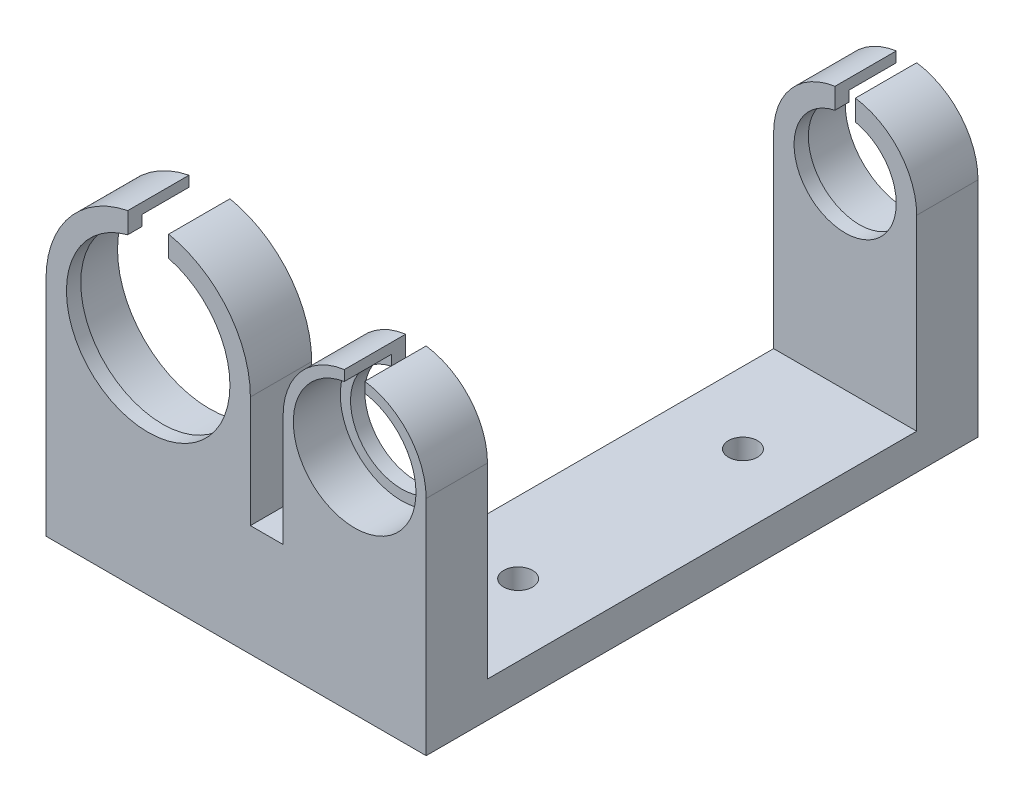
ISO-10303-21;
HEADER;
FILE_DESCRIPTION(('STEP AP214'),'2;1');
FILE_NAME('part.step','',(''),(''),'','','');
FILE_SCHEMA(('AUTOMOTIVE_DESIGN { 1 0 10303 214 1 1 1 1 }'));
ENDSEC;
DATA;
#1=APPLICATION_CONTEXT('core data for automotive mechanical design processes');
#2=APPLICATION_PROTOCOL_DEFINITION('international standard','automotive_design',2000,#1);
#3=PRODUCT_CONTEXT('',#1,'mechanical');
#4=PRODUCT('Part','Part','',(#3));
#5=PRODUCT_RELATED_PRODUCT_CATEGORY('part','',(#4));
#6=PRODUCT_DEFINITION_FORMATION('','',#4);
#7=PRODUCT_DEFINITION_CONTEXT('part definition',#1,'design');
#8=PRODUCT_DEFINITION('design','',#6,#7);
#9=PRODUCT_DEFINITION_SHAPE('','',#8);
#10=(LENGTH_UNIT() NAMED_UNIT(*) SI_UNIT(.MILLI.,.METRE.));
#11=(NAMED_UNIT(*) PLANE_ANGLE_UNIT() SI_UNIT($,.RADIAN.));
#12=(NAMED_UNIT(*) SI_UNIT($,.STERADIAN.) SOLID_ANGLE_UNIT());
#13=UNCERTAINTY_MEASURE_WITH_UNIT(LENGTH_MEASURE(1.E-05),#10,'distance_accuracy_value','');
#14=(GEOMETRIC_REPRESENTATION_CONTEXT(3) GLOBAL_UNCERTAINTY_ASSIGNED_CONTEXT((#13)) GLOBAL_UNIT_ASSIGNED_CONTEXT((#10,
#11,#12)) REPRESENTATION_CONTEXT('',''));
#15=CARTESIAN_POINT('',(0.,0.,0.));
#16=DIRECTION('',(0.,0.,1.));
#17=DIRECTION('',(1.,0.,0.));
#18=AXIS2_PLACEMENT_3D('',#15,#16,#17);
#19=CARTESIAN_POINT('',(0.,0.,-60.96));
#20=DIRECTION('',(0.,0.,-1.));
#21=DIRECTION('',(-1.,0.,0.));
#22=AXIS2_PLACEMENT_3D('',#19,#20,#21);
#23=CYLINDRICAL_SURFACE('',#22,7.62);
#24=CARTESIAN_POINT('',(0.,0.,-62.738));
#25=DIRECTION('',(0.,0.,-1.));
#26=DIRECTION('',(-1.,0.,0.));
#27=AXIS2_PLACEMENT_3D('',#24,#25,#26);
#28=CIRCLE('',#27,7.62);
#29=CARTESIAN_POINT('',(-1.27,7.51342132453651,-62.738));
#30=VERTEX_POINT('',#29);
#31=CARTESIAN_POINT('',(1.27,7.51342132453651,-62.738));
#32=VERTEX_POINT('',#31);
#33=EDGE_CURVE('E249',#30,#32,#28,.F.);
#34=ORIENTED_EDGE('',*,*,#33,.T.);
#35=DIRECTION('',(0.,0.,-1.));
#36=VECTOR('',#35,1.);
#37=CARTESIAN_POINT('',(1.27,7.51342132453651,-60.96));
#38=LINE('',#37,#36);
#39=CARTESIAN_POINT('',(1.27,7.51342132453651,-68.58));
#40=VERTEX_POINT('',#39);
#41=EDGE_CURVE('E309',#32,#40,#38,.T.);
#42=ORIENTED_EDGE('',*,*,#41,.T.);
#43=CARTESIAN_POINT('',(0.,0.,-68.58));
#44=DIRECTION('',(0.,0.,-1.));
#45=DIRECTION('',(-1.,0.,0.));
#46=AXIS2_PLACEMENT_3D('',#43,#44,#45);
#47=CIRCLE('',#46,7.62);
#48=CARTESIAN_POINT('',(-1.27,7.51342132453651,-68.58));
#49=VERTEX_POINT('',#48);
#50=EDGE_CURVE('E298',#40,#49,#47,.T.);
#51=ORIENTED_EDGE('',*,*,#50,.T.);
#52=DIRECTION('',(0.,0.,-1.));
#53=VECTOR('',#52,1.);
#54=CARTESIAN_POINT('',(-1.27,7.51342132453651,-60.96));
#55=LINE('',#54,#53);
#56=EDGE_CURVE('E311',#30,#49,#55,.T.);
#57=ORIENTED_EDGE('',*,*,#56,.F.);
#58=EDGE_LOOP('',(#34,#42,#51,#57));
#59=FACE_BOUND('',#58,.T.);
#60=ADVANCED_FACE('F34',(#59),#23,.F.);
#61=CARTESIAN_POINT('',(8.89,-23.241,-68.58));
#62=DIRECTION('',(0.,-1.,0.));
#63=DIRECTION('',(0.,0.,-1.));
#64=AXIS2_PLACEMENT_3D('',#61,#62,#63);
#65=PLANE('',#64);
#66=CARTESIAN_POINT('',(0.,-23.241,-20.32));
#67=DIRECTION('',(0.,1.,0.));
#68=DIRECTION('',(0.,0.,1.));
#69=AXIS2_PLACEMENT_3D('',#66,#67,#68);
#70=CIRCLE('',#69,1.8);
#71=CARTESIAN_POINT('',(0.,-23.241,-18.52));
#72=VERTEX_POINT('',#71);
#73=EDGE_CURVE('E740',#72,#72,#70,.T.);
#74=ORIENTED_EDGE('',*,*,#73,.F.);
#75=EDGE_LOOP('',(#74));
#76=FACE_BOUND('',#75,.T.);
#77=CARTESIAN_POINT('',(0.,-23.241,-48.26));
#78=DIRECTION('',(0.,1.,0.));
#79=DIRECTION('',(0.,0.,1.));
#80=AXIS2_PLACEMENT_3D('',#77,#78,#79);
#81=CIRCLE('',#80,1.8);
#82=CARTESIAN_POINT('',(0.,-23.241,-46.46));
#83=VERTEX_POINT('',#82);
#84=EDGE_CURVE('E742',#83,#83,#81,.T.);
#85=ORIENTED_EDGE('',*,*,#84,.F.);
#86=EDGE_LOOP('',(#85));
#87=FACE_BOUND('',#86,.T.);
#88=DIRECTION('',(1.,0.,0.));
#89=VECTOR('',#88,1.);
#90=CARTESIAN_POINT('',(0.,-23.241,-60.96));
#91=LINE('',#90,#89);
#92=CARTESIAN_POINT('',(-8.89,-23.241,-60.96));
#93=VERTEX_POINT('',#92);
#94=CARTESIAN_POINT('',(8.89,-23.241,-60.96));
#95=VERTEX_POINT('',#94);
#96=EDGE_CURVE('E290',#93,#95,#91,.T.);
#97=ORIENTED_EDGE('',*,*,#96,.F.);
#98=DIRECTION('',(0.,0.,1.));
#99=VECTOR('',#98,1.);
#100=CARTESIAN_POINT('',(-8.89,-23.241,-68.58));
#101=LINE('',#100,#99);
#102=CARTESIAN_POINT('',(-8.89,-23.241,-7.62));
#103=VERTEX_POINT('',#102);
#104=EDGE_CURVE('E329',#93,#103,#101,.T.);
#105=ORIENTED_EDGE('',*,*,#104,.T.);
#106=DIRECTION('',(1.,0.,0.));
#107=VECTOR('',#106,1.);
#108=CARTESIAN_POINT('',(8.89,-23.241,-7.62));
#109=LINE('',#108,#107);
#110=CARTESIAN_POINT('',(8.89,-23.241,-7.62));
#111=VERTEX_POINT('',#110);
#112=EDGE_CURVE('E321',#103,#111,#109,.T.);
#113=ORIENTED_EDGE('',*,*,#112,.T.);
#114=DIRECTION('',(0.,0.,1.));
#115=VECTOR('',#114,1.);
#116=CARTESIAN_POINT('',(8.89,-23.241,-68.58));
#117=LINE('',#116,#115);
#118=EDGE_CURVE('E59',#95,#111,#117,.T.);
#119=ORIENTED_EDGE('',*,*,#118,.F.);
#120=EDGE_LOOP('',(#97,#105,#113,#119));
#121=FACE_BOUND('',#120,.T.);
#122=ADVANCED_FACE('F502',(#76,#87,#121),#65,.F.);
#123=CARTESIAN_POINT('',(0.,0.,-7.62));
#124=DIRECTION('',(0.,0.,1.));
#125=DIRECTION('',(1.,0.,0.));
#126=AXIS2_PLACEMENT_3D('',#123,#124,#125);
#127=PLANE('',#126);
#128=ORIENTED_EDGE('',*,*,#112,.F.);
#129=DIRECTION('',(0.,1.,0.));
#130=VECTOR('',#129,1.);
#131=CARTESIAN_POINT('',(-8.89,-27.686,-7.62));
#132=LINE('',#131,#130);
#133=CARTESIAN_POINT('',(-8.89,-27.686,-7.62));
#134=VERTEX_POINT('',#133);
#135=EDGE_CURVE('E51',#134,#103,#132,.T.);
#136=ORIENTED_EDGE('',*,*,#135,.F.);
#137=DIRECTION('',(1.,0.,0.));
#138=VECTOR('',#137,1.);
#139=CARTESIAN_POINT('',(0.,-27.686,-7.62));
#140=LINE('',#139,#138);
#141=CARTESIAN_POINT('',(-38.354,-27.686,-7.62));
#142=VERTEX_POINT('',#141);
#143=EDGE_CURVE('E408',#142,#134,#140,.T.);
#144=ORIENTED_EDGE('',*,*,#143,.F.);
#145=DIRECTION('',(0.,1.,0.));
#146=VECTOR('',#145,1.);
#147=CARTESIAN_POINT('',(-38.354,0.,-7.62));
#148=LINE('',#147,#146);
#149=CARTESIAN_POINT('',(-38.354,0.,-7.62));
#150=VERTEX_POINT('',#149);
#151=EDGE_CURVE('E406',#142,#150,#148,.T.);
#152=ORIENTED_EDGE('',*,*,#151,.T.);
#153=CARTESIAN_POINT('',(-25.654,0.,-7.62));
#154=DIRECTION('',(0.,0.,1.));
#155=DIRECTION('',(1.,0.,0.));
#156=AXIS2_PLACEMENT_3D('',#153,#154,#155);
#157=CIRCLE('',#156,12.7);
#158=CARTESIAN_POINT('',(-28.194,12.4434078933385,-7.62));
#159=VERTEX_POINT('',#158);
#160=EDGE_CURVE('E403',#159,#150,#157,.T.);
#161=ORIENTED_EDGE('',*,*,#160,.F.);
#162=DIRECTION('',(0.,1.,0.));
#163=VECTOR('',#162,1.);
#164=CARTESIAN_POINT('',(-28.194,0.,-7.62));
#165=LINE('',#164,#163);
#166=CARTESIAN_POINT('',(-28.194,11.144204771988,-7.62));
#167=VERTEX_POINT('',#166);
#168=EDGE_CURVE('E400',#167,#159,#165,.T.);
#169=ORIENTED_EDGE('',*,*,#168,.F.);
#170=CARTESIAN_POINT('',(-25.654,0.,-7.62));
#171=DIRECTION('',(0.,0.,1.));
#172=DIRECTION('',(1.,0.,0.));
#173=AXIS2_PLACEMENT_3D('',#170,#171,#172);
#174=CIRCLE('',#173,11.43);
#175=CARTESIAN_POINT('',(-23.114,11.144204771988,-7.62));
#176=VERTEX_POINT('',#175);
#177=EDGE_CURVE('E398',#167,#176,#174,.T.);
#178=ORIENTED_EDGE('',*,*,#177,.T.);
#179=DIRECTION('',(0.,1.,0.));
#180=VECTOR('',#179,1.);
#181=CARTESIAN_POINT('',(-23.114,0.,-7.62));
#182=LINE('',#181,#180);
#183=CARTESIAN_POINT('',(-23.114,12.4434078933385,-7.62));
#184=VERTEX_POINT('',#183);
#185=EDGE_CURVE('E396',#176,#184,#182,.T.);
#186=ORIENTED_EDGE('',*,*,#185,.T.);
#187=CARTESIAN_POINT('',(-25.654,0.,-7.62));
#188=DIRECTION('',(0.,0.,1.));
#189=DIRECTION('',(1.,0.,0.));
#190=AXIS2_PLACEMENT_3D('',#187,#188,#189);
#191=CIRCLE('',#190,12.7);
#192=CARTESIAN_POINT('',(-12.954,0.,-7.62));
#193=VERTEX_POINT('',#192);
#194=EDGE_CURVE('E393',#193,#184,#191,.T.);
#195=ORIENTED_EDGE('',*,*,#194,.F.);
#196=DIRECTION('',(0.,-1.,0.));
#197=VECTOR('',#196,1.);
#198=CARTESIAN_POINT('',(-12.954,0.,-7.62));
#199=LINE('',#198,#197);
#200=CARTESIAN_POINT('',(-12.954,-13.843,-7.62));
#201=VERTEX_POINT('',#200);
#202=EDGE_CURVE('E391',#193,#201,#199,.T.);
#203=ORIENTED_EDGE('',*,*,#202,.T.);
#204=DIRECTION('',(1.,0.,0.));
#205=VECTOR('',#204,1.);
#206=CARTESIAN_POINT('',(0.,-13.843,-7.62));
#207=LINE('',#206,#205);
#208=CARTESIAN_POINT('',(-8.89,-13.843,-7.62));
#209=VERTEX_POINT('',#208);
#210=EDGE_CURVE('E389',#201,#209,#207,.T.);
#211=ORIENTED_EDGE('',*,*,#210,.T.);
#212=DIRECTION('',(0.,-1.,0.));
#213=VECTOR('',#212,1.);
#214=CARTESIAN_POINT('',(-8.89,0.,-7.62));
#215=LINE('',#214,#213);
#216=CARTESIAN_POINT('',(-8.89,0.,-7.62));
#217=VERTEX_POINT('',#216);
#218=EDGE_CURVE('E386',#217,#209,#215,.T.);
#219=ORIENTED_EDGE('',*,*,#218,.F.);
#220=CARTESIAN_POINT('',(0.,0.,-7.62));
#221=DIRECTION('',(0.,0.,1.));
#222=DIRECTION('',(1.,0.,0.));
#223=AXIS2_PLACEMENT_3D('',#220,#221,#222);
#224=CIRCLE('',#223,8.89);
#225=CARTESIAN_POINT('',(-1.27,8.7988181024499,-7.62));
#226=VERTEX_POINT('',#225);
#227=EDGE_CURVE('E383',#226,#217,#224,.T.);
#228=ORIENTED_EDGE('',*,*,#227,.F.);
#229=DIRECTION('',(0.,1.,0.));
#230=VECTOR('',#229,1.);
#231=CARTESIAN_POINT('',(-1.27,0.,-7.62));
#232=LINE('',#231,#230);
#233=CARTESIAN_POINT('',(-1.27,6.22170394666927,-7.62));
#234=VERTEX_POINT('',#233);
#235=EDGE_CURVE('E380',#234,#226,#232,.T.);
#236=ORIENTED_EDGE('',*,*,#235,.F.);
#237=CARTESIAN_POINT('',(0.,0.,-7.62));
#238=DIRECTION('',(0.,0.,-1.));
#239=DIRECTION('',(-1.,0.,0.));
#240=AXIS2_PLACEMENT_3D('',#237,#238,#239);
#241=CIRCLE('',#240,6.35);
#242=CARTESIAN_POINT('',(1.27,6.22170394666927,-7.62));
#243=VERTEX_POINT('',#242);
#244=EDGE_CURVE('E351',#243,#234,#241,.T.);
#245=ORIENTED_EDGE('',*,*,#244,.F.);
#246=DIRECTION('',(0.,1.,0.));
#247=VECTOR('',#246,1.);
#248=CARTESIAN_POINT('',(1.27,0.,-7.62));
#249=LINE('',#248,#247);
#250=CARTESIAN_POINT('',(1.27,8.7988181024499,-7.62));
#251=VERTEX_POINT('',#250);
#252=EDGE_CURVE('E378',#243,#251,#249,.T.);
#253=ORIENTED_EDGE('',*,*,#252,.T.);
#254=CARTESIAN_POINT('',(0.,0.,-7.62));
#255=DIRECTION('',(0.,0.,1.));
#256=DIRECTION('',(1.,0.,0.));
#257=AXIS2_PLACEMENT_3D('',#254,#255,#256);
#258=CIRCLE('',#257,8.89);
#259=CARTESIAN_POINT('',(8.89,0.,-7.62));
#260=VERTEX_POINT('',#259);
#261=EDGE_CURVE('E374',#260,#251,#258,.T.);
#262=ORIENTED_EDGE('',*,*,#261,.F.);
#263=DIRECTION('',(0.,-1.,0.));
#264=VECTOR('',#263,1.);
#265=CARTESIAN_POINT('',(8.89,0.,-7.62));
#266=LINE('',#265,#264);
#267=EDGE_CURVE('E372',#260,#111,#266,.T.);
#268=ORIENTED_EDGE('',*,*,#267,.T.);
#269=EDGE_LOOP('',(#128,#136,#144,#152,#161,#169,#178,#186,#195,#203,#211,#219,#228,#236,#245,
#253,#262,#268));
#270=FACE_BOUND('',#269,.T.);
#271=ADVANCED_FACE('F508',(#270),#127,.F.);
#272=CARTESIAN_POINT('',(-25.654,0.,-7.62));
#273=DIRECTION('',(0.,0.,1.));
#274=DIRECTION('',(1.,0.,0.));
#275=AXIS2_PLACEMENT_3D('',#272,#273,#274);
#276=CYLINDRICAL_SURFACE('',#275,11.43);
#277=CARTESIAN_POINT('',(-25.654,0.,-1.778));
#278=DIRECTION('',(0.,0.,1.));
#279=DIRECTION('',(1.,0.,0.));
#280=AXIS2_PLACEMENT_3D('',#277,#278,#279);
#281=CIRCLE('',#280,11.43);
#282=CARTESIAN_POINT('',(-23.114,11.144204771988,-1.778));
#283=VERTEX_POINT('',#282);
#284=CARTESIAN_POINT('',(-28.194,11.144204771988,-1.778));
#285=VERTEX_POINT('',#284);
#286=EDGE_CURVE('E339',#283,#285,#281,.F.);
#287=ORIENTED_EDGE('',*,*,#286,.F.);
#288=DIRECTION('',(0.,0.,1.));
#289=VECTOR('',#288,1.);
#290=CARTESIAN_POINT('',(-23.114,11.144204771988,-7.62));
#291=LINE('',#290,#289);
#292=EDGE_CURVE('E459',#176,#283,#291,.T.);
#293=ORIENTED_EDGE('',*,*,#292,.F.);
#294=ORIENTED_EDGE('',*,*,#177,.F.);
#295=DIRECTION('',(0.,0.,1.));
#296=VECTOR('',#295,1.);
#297=CARTESIAN_POINT('',(-28.194,11.144204771988,-7.62));
#298=LINE('',#297,#296);
#299=EDGE_CURVE('E457',#167,#285,#298,.T.);
#300=ORIENTED_EDGE('',*,*,#299,.T.);
#301=EDGE_LOOP('',(#287,#293,#294,#300));
#302=FACE_BOUND('',#301,.T.);
#303=ADVANCED_FACE('F543',(#302),#276,.F.);
#304=CARTESIAN_POINT('',(0.,0.,-7.62));
#305=DIRECTION('',(0.,0.,1.));
#306=DIRECTION('',(1.,0.,0.));
#307=AXIS2_PLACEMENT_3D('',#304,#305,#306);
#308=CYLINDRICAL_SURFACE('',#307,7.62);
#309=CARTESIAN_POINT('',(0.,0.,-5.842));
#310=DIRECTION('',(0.,0.,-1.));
#311=DIRECTION('',(-1.,0.,0.));
#312=AXIS2_PLACEMENT_3D('',#309,#310,#311);
#313=CIRCLE('',#312,7.62);
#314=CARTESIAN_POINT('',(-1.27,7.51342132453651,-5.842));
#315=VERTEX_POINT('',#314);
#316=CARTESIAN_POINT('',(1.27,7.51342132453651,-5.842));
#317=VERTEX_POINT('',#316);
#318=EDGE_CURVE('E358',#315,#317,#313,.F.);
#319=ORIENTED_EDGE('',*,*,#318,.F.);
#320=DIRECTION('',(0.,0.,1.));
#321=VECTOR('',#320,1.);
#322=CARTESIAN_POINT('',(-1.27,7.51342132453651,-7.62));
#323=LINE('',#322,#321);
#324=CARTESIAN_POINT('',(-1.27,7.51342132453651,0.));
#325=VERTEX_POINT('',#324);
#326=EDGE_CURVE('E475',#315,#325,#323,.T.);
#327=ORIENTED_EDGE('',*,*,#326,.T.);
#328=CARTESIAN_POINT('',(0.,0.,0.));
#329=DIRECTION('',(0.,0.,1.));
#330=DIRECTION('',(1.,0.,0.));
#331=AXIS2_PLACEMENT_3D('',#328,#329,#330);
#332=CIRCLE('',#331,7.62);
#333=CARTESIAN_POINT('',(1.27,7.51342132453651,0.));
#334=VERTEX_POINT('',#333);
#335=EDGE_CURVE('E418',#325,#334,#332,.T.);
#336=ORIENTED_EDGE('',*,*,#335,.T.);
#337=DIRECTION('',(0.,0.,1.));
#338=VECTOR('',#337,1.);
#339=CARTESIAN_POINT('',(1.27,7.51342132453651,-7.62));
#340=LINE('',#339,#338);
#341=EDGE_CURVE('E477',#317,#334,#340,.T.);
#342=ORIENTED_EDGE('',*,*,#341,.F.);
#343=EDGE_LOOP('',(#319,#327,#336,#342));
#344=FACE_BOUND('',#343,.T.);
#345=ADVANCED_FACE('F564',(#344),#308,.F.);
#346=CARTESIAN_POINT('',(8.89,0.,-7.62));
#347=DIRECTION('',(-1.,0.,0.));
#348=DIRECTION('',(0.,0.,1.));
#349=AXIS2_PLACEMENT_3D('',#346,#347,#348);
#350=PLANE('',#349);
#351=DIRECTION('',(0.,-1.,0.));
#352=VECTOR('',#351,1.);
#353=CARTESIAN_POINT('',(8.89,0.,0.));
#354=LINE('',#353,#352);
#355=CARTESIAN_POINT('',(8.89,0.,0.));
#356=VERTEX_POINT('',#355);
#357=CARTESIAN_POINT('',(8.89,-27.686,0.));
#358=VERTEX_POINT('',#357);
#359=EDGE_CURVE('E369',#356,#358,#354,.T.);
#360=ORIENTED_EDGE('',*,*,#359,.T.);
#361=DIRECTION('',(0.,0.,1.));
#362=VECTOR('',#361,1.);
#363=CARTESIAN_POINT('',(8.89,-27.686,-7.62));
#364=LINE('',#363,#362);
#365=CARTESIAN_POINT('',(8.89,-27.686,-68.58));
#366=VERTEX_POINT('',#365);
#367=EDGE_CURVE('E11',#366,#358,#364,.T.);
#368=ORIENTED_EDGE('',*,*,#367,.F.);
#369=DIRECTION('',(0.,-1.,0.));
#370=VECTOR('',#369,1.);
#371=CARTESIAN_POINT('',(8.89,-27.686,-68.58));
#372=LINE('',#371,#370);
#373=CARTESIAN_POINT('',(8.89,0.,-68.58));
#374=VERTEX_POINT('',#373);
#375=EDGE_CURVE('E317',#374,#366,#372,.T.);
#376=ORIENTED_EDGE('',*,*,#375,.F.);
#377=DIRECTION('',(0.,0.,-1.));
#378=VECTOR('',#377,1.);
#379=CARTESIAN_POINT('',(8.89,0.,-60.96));
#380=LINE('',#379,#378);
#381=CARTESIAN_POINT('',(8.89,0.,-60.96));
#382=VERTEX_POINT('',#381);
#383=EDGE_CURVE('E304',#382,#374,#380,.T.);
#384=ORIENTED_EDGE('',*,*,#383,.F.);
#385=DIRECTION('',(0.,-1.,0.));
#386=VECTOR('',#385,1.);
#387=CARTESIAN_POINT('',(8.89,0.,-60.96));
#388=LINE('',#387,#386);
#389=EDGE_CURVE('E288',#382,#95,#388,.T.);
#390=ORIENTED_EDGE('',*,*,#389,.T.);
#391=ORIENTED_EDGE('',*,*,#118,.T.);
#392=ORIENTED_EDGE('',*,*,#267,.F.);
#393=DIRECTION('',(0.,0.,1.));
#394=VECTOR('',#393,1.);
#395=CARTESIAN_POINT('',(8.89,0.,-7.62));
#396=LINE('',#395,#394);
#397=EDGE_CURVE('E38',#260,#356,#396,.T.);
#398=ORIENTED_EDGE('',*,*,#397,.T.);
#399=EDGE_LOOP('',(#360,#368,#376,#384,#390,#391,#392,#398));
#400=FACE_BOUND('',#399,.T.);
#401=ADVANCED_FACE('F36',(#400),#350,.F.);
#402=CARTESIAN_POINT('',(0.,-27.686,-7.62));
#403=DIRECTION('',(0.,-1.,0.));
#404=DIRECTION('',(0.,0.,-1.));
#405=AXIS2_PLACEMENT_3D('',#402,#403,#404);
#406=PLANE('',#405);
#407=CARTESIAN_POINT('',(0.,-27.686,-20.32));
#408=DIRECTION('',(0.,-1.,0.));
#409=DIRECTION('',(0.,0.,-1.));
#410=AXIS2_PLACEMENT_3D('',#407,#408,#409);
#411=CIRCLE('',#410,1.8);
#412=CARTESIAN_POINT('',(0.,-27.686,-22.12));
#413=VERTEX_POINT('',#412);
#414=EDGE_CURVE('E737',#413,#413,#411,.T.);
#415=ORIENTED_EDGE('',*,*,#414,.F.);
#416=EDGE_LOOP('',(#415));
#417=FACE_BOUND('',#416,.T.);
#418=CARTESIAN_POINT('',(0.,-27.686,-48.26));
#419=DIRECTION('',(0.,-1.,0.));
#420=DIRECTION('',(0.,0.,-1.));
#421=AXIS2_PLACEMENT_3D('',#418,#419,#420);
#422=CIRCLE('',#421,1.8);
#423=CARTESIAN_POINT('',(0.,-27.686,-50.06));
#424=VERTEX_POINT('',#423);
#425=EDGE_CURVE('E269',#424,#424,#422,.T.);
#426=ORIENTED_EDGE('',*,*,#425,.F.);
#427=EDGE_LOOP('',(#426));
#428=FACE_BOUND('',#427,.T.);
#429=DIRECTION('',(1.,0.,0.));
#430=VECTOR('',#429,1.);
#431=CARTESIAN_POINT('',(0.,-27.686,0.));
#432=LINE('',#431,#430);
#433=CARTESIAN_POINT('',(-38.354,-27.686,0.));
#434=VERTEX_POINT('',#433);
#435=EDGE_CURVE('E375',#434,#358,#432,.T.);
#436=ORIENTED_EDGE('',*,*,#435,.F.);
#437=DIRECTION('',(0.,0.,1.));
#438=VECTOR('',#437,1.);
#439=CARTESIAN_POINT('',(-38.354,-27.686,-7.62));
#440=LINE('',#439,#438);
#441=EDGE_CURVE('E43',#142,#434,#440,.T.);
#442=ORIENTED_EDGE('',*,*,#441,.F.);
#443=ORIENTED_EDGE('',*,*,#143,.T.);
#444=DIRECTION('',(0.,0.,1.));
#445=VECTOR('',#444,1.);
#446=CARTESIAN_POINT('',(-8.89,-27.686,-68.58));
#447=LINE('',#446,#445);
#448=CARTESIAN_POINT('',(-8.89,-27.686,-68.58));
#449=VERTEX_POINT('',#448);
#450=EDGE_CURVE('E331',#449,#134,#447,.T.);
#451=ORIENTED_EDGE('',*,*,#450,.F.);
#452=DIRECTION('',(-1.,0.,0.));
#453=VECTOR('',#452,1.);
#454=CARTESIAN_POINT('',(8.89,-27.686,-68.58));
#455=LINE('',#454,#453);
#456=EDGE_CURVE('E320',#366,#449,#455,.T.);
#457=ORIENTED_EDGE('',*,*,#456,.F.);
#458=ORIENTED_EDGE('',*,*,#367,.T.);
#459=EDGE_LOOP('',(#436,#442,#443,#451,#457,#458));
#460=FACE_BOUND('',#459,.T.);
#461=ADVANCED_FACE('F545',(#417,#428,#460),#406,.T.);
#462=CARTESIAN_POINT('',(-38.354,0.,-7.62));
#463=DIRECTION('',(1.,0.,0.));
#464=DIRECTION('',(0.,0.,-1.));
#465=AXIS2_PLACEMENT_3D('',#462,#463,#464);
#466=PLANE('',#465);
#467=DIRECTION('',(0.,1.,0.));
#468=VECTOR('',#467,1.);
#469=CARTESIAN_POINT('',(-38.354,0.,0.));
#470=LINE('',#469,#468);
#471=CARTESIAN_POINT('',(-38.354,0.,0.));
#472=VERTEX_POINT('',#471);
#473=EDGE_CURVE('E447',#434,#472,#470,.T.);
#474=ORIENTED_EDGE('',*,*,#473,.T.);
#475=DIRECTION('',(0.,0.,1.));
#476=VECTOR('',#475,1.);
#477=CARTESIAN_POINT('',(-38.354,0.,-7.62));
#478=LINE('',#477,#476);
#479=EDGE_CURVE('E453',#150,#472,#478,.T.);
#480=ORIENTED_EDGE('',*,*,#479,.F.);
#481=ORIENTED_EDGE('',*,*,#151,.F.);
#482=ORIENTED_EDGE('',*,*,#441,.T.);
#483=EDGE_LOOP('',(#474,#480,#481,#482));
#484=FACE_BOUND('',#483,.T.);
#485=ADVANCED_FACE('F548',(#484),#466,.F.);
#486=CARTESIAN_POINT('',(-25.654,0.,-7.62));
#487=DIRECTION('',(0.,0.,1.));
#488=DIRECTION('',(1.,0.,0.));
#489=AXIS2_PLACEMENT_3D('',#486,#487,#488);
#490=CYLINDRICAL_SURFACE('',#489,12.7);
#491=CARTESIAN_POINT('',(-25.654,0.,0.));
#492=DIRECTION('',(0.,0.,1.));
#493=DIRECTION('',(1.,0.,0.));
#494=AXIS2_PLACEMENT_3D('',#491,#492,#493);
#495=CIRCLE('',#494,12.7);
#496=CARTESIAN_POINT('',(-28.194,12.4434078933385,0.));
#497=VERTEX_POINT('',#496);
#498=EDGE_CURVE('E444',#497,#472,#495,.T.);
#499=ORIENTED_EDGE('',*,*,#498,.F.);
#500=DIRECTION('',(0.,0.,1.));
#501=VECTOR('',#500,1.);
#502=CARTESIAN_POINT('',(-28.194,12.4434078933385,-7.62));
#503=LINE('',#502,#501);
#504=EDGE_CURVE('E455',#159,#497,#503,.T.);
#505=ORIENTED_EDGE('',*,*,#504,.F.);
#506=ORIENTED_EDGE('',*,*,#160,.T.);
#507=ORIENTED_EDGE('',*,*,#479,.T.);
#508=EDGE_LOOP('',(#499,#505,#506,#507));
#509=FACE_BOUND('',#508,.T.);
#510=ADVANCED_FACE('F552',(#509),#490,.T.);
#511=CARTESIAN_POINT('',(-28.194,0.,-7.62));
#512=DIRECTION('',(1.,0.,0.));
#513=DIRECTION('',(0.,0.,-1.));
#514=AXIS2_PLACEMENT_3D('',#511,#512,#513);
#515=PLANE('',#514);
#516=DIRECTION('',(0.,1.,0.));
#517=VECTOR('',#516,1.);
#518=CARTESIAN_POINT('',(-28.194,0.,0.));
#519=LINE('',#518,#517);
#520=CARTESIAN_POINT('',(-28.194,9.83737769936684,0.));
#521=VERTEX_POINT('',#520);
#522=EDGE_CURVE('E441',#521,#497,#519,.T.);
#523=ORIENTED_EDGE('',*,*,#522,.F.);
#524=DIRECTION('',(0.,0.,1.));
#525=VECTOR('',#524,1.);
#526=CARTESIAN_POINT('',(-28.194,9.83737769936684,-1.778));
#527=LINE('',#526,#525);
#528=CARTESIAN_POINT('',(-28.194,9.83737769936684,-1.778));
#529=VERTEX_POINT('',#528);
#530=EDGE_CURVE('E345',#529,#521,#527,.T.);
#531=ORIENTED_EDGE('',*,*,#530,.F.);
#532=DIRECTION('',(0.,-1.,0.));
#533=VECTOR('',#532,1.);
#534=CARTESIAN_POINT('',(-28.194,0.,-1.778));
#535=LINE('',#534,#533);
#536=EDGE_CURVE('E337',#285,#529,#535,.T.);
#537=ORIENTED_EDGE('',*,*,#536,.F.);
#538=ORIENTED_EDGE('',*,*,#299,.F.);
#539=ORIENTED_EDGE('',*,*,#168,.T.);
#540=ORIENTED_EDGE('',*,*,#504,.T.);
#541=EDGE_LOOP('',(#523,#531,#537,#538,#539,#540));
#542=FACE_BOUND('',#541,.T.);
#543=ADVANCED_FACE('F556',(#542),#515,.T.);
#544=CARTESIAN_POINT('',(-23.114,0.,-7.62));
#545=DIRECTION('',(1.,0.,0.));
#546=DIRECTION('',(0.,1.,0.));
#547=AXIS2_PLACEMENT_3D('',#544,#545,#546);
#548=PLANE('',#547);
#549=DIRECTION('',(0.,1.,0.));
#550=VECTOR('',#549,1.);
#551=CARTESIAN_POINT('',(-23.114,0.,0.));
#552=LINE('',#551,#550);
#553=CARTESIAN_POINT('',(-23.114,9.83737769936684,0.));
#554=VERTEX_POINT('',#553);
#555=CARTESIAN_POINT('',(-23.114,12.4434078933385,0.));
#556=VERTEX_POINT('',#555);
#557=EDGE_CURVE('E438',#554,#556,#552,.T.);
#558=ORIENTED_EDGE('',*,*,#557,.T.);
#559=DIRECTION('',(0.,0.,1.));
#560=VECTOR('',#559,1.);
#561=CARTESIAN_POINT('',(-23.114,12.4434078933385,-7.62));
#562=LINE('',#561,#560);
#563=EDGE_CURVE('E462',#184,#556,#562,.T.);
#564=ORIENTED_EDGE('',*,*,#563,.F.);
#565=ORIENTED_EDGE('',*,*,#185,.F.);
#566=ORIENTED_EDGE('',*,*,#292,.T.);
#567=DIRECTION('',(0.,-1.,0.));
#568=VECTOR('',#567,1.);
#569=CARTESIAN_POINT('',(-23.114,0.,-1.778));
#570=LINE('',#569,#568);
#571=CARTESIAN_POINT('',(-23.114,9.83737769936684,-1.778));
#572=VERTEX_POINT('',#571);
#573=EDGE_CURVE('E342',#283,#572,#570,.T.);
#574=ORIENTED_EDGE('',*,*,#573,.T.);
#575=DIRECTION('',(0.,0.,1.));
#576=VECTOR('',#575,1.);
#577=CARTESIAN_POINT('',(-23.114,9.83737769936684,-1.778));
#578=LINE('',#577,#576);
#579=EDGE_CURVE('E348',#572,#554,#578,.T.);
#580=ORIENTED_EDGE('',*,*,#579,.T.);
#581=EDGE_LOOP('',(#558,#564,#565,#566,#574,#580));
#582=FACE_BOUND('',#581,.T.);
#583=ADVANCED_FACE('F560',(#582),#548,.F.);
#584=CARTESIAN_POINT('',(-25.654,0.,-7.62));
#585=DIRECTION('',(0.,0.,1.));
#586=DIRECTION('',(1.,0.,0.));
#587=AXIS2_PLACEMENT_3D('',#584,#585,#586);
#588=CYLINDRICAL_SURFACE('',#587,12.7);
#589=CARTESIAN_POINT('',(-25.654,0.,0.));
#590=DIRECTION('',(0.,0.,1.));
#591=DIRECTION('',(1.,0.,0.));
#592=AXIS2_PLACEMENT_3D('',#589,#590,#591);
#593=CIRCLE('',#592,12.7);
#594=CARTESIAN_POINT('',(-12.954,0.,0.));
#595=VERTEX_POINT('',#594);
#596=EDGE_CURVE('E435',#595,#556,#593,.T.);
#597=ORIENTED_EDGE('',*,*,#596,.F.);
#598=DIRECTION('',(0.,0.,1.));
#599=VECTOR('',#598,1.);
#600=CARTESIAN_POINT('',(-12.954,0.,-7.62));
#601=LINE('',#600,#599);
#602=EDGE_CURVE('E464',#193,#595,#601,.T.);
#603=ORIENTED_EDGE('',*,*,#602,.F.);
#604=ORIENTED_EDGE('',*,*,#194,.T.);
#605=ORIENTED_EDGE('',*,*,#563,.T.);
#606=EDGE_LOOP('',(#597,#603,#604,#605));
#607=FACE_BOUND('',#606,.T.);
#608=ADVANCED_FACE('F568',(#607),#588,.T.);
#609=CARTESIAN_POINT('',(-12.954,0.,-7.62));
#610=DIRECTION('',(-1.,0.,0.));
#611=DIRECTION('',(0.,-1.,0.));
#612=AXIS2_PLACEMENT_3D('',#609,#610,#611);
#613=PLANE('',#612);
#614=DIRECTION('',(0.,-1.,0.));
#615=VECTOR('',#614,1.);
#616=CARTESIAN_POINT('',(-12.954,0.,0.));
#617=LINE('',#616,#615);
#618=CARTESIAN_POINT('',(-12.954,-13.843,0.));
#619=VERTEX_POINT('',#618);
#620=EDGE_CURVE('E433',#595,#619,#617,.T.);
#621=ORIENTED_EDGE('',*,*,#620,.T.);
#622=DIRECTION('',(0.,0.,1.));
#623=VECTOR('',#622,1.);
#624=CARTESIAN_POINT('',(-12.954,-13.843,-7.62));
#625=LINE('',#624,#623);
#626=EDGE_CURVE('E466',#201,#619,#625,.T.);
#627=ORIENTED_EDGE('',*,*,#626,.F.);
#628=ORIENTED_EDGE('',*,*,#202,.F.);
#629=ORIENTED_EDGE('',*,*,#602,.T.);
#630=EDGE_LOOP('',(#621,#627,#628,#629));
#631=FACE_BOUND('',#630,.T.);
#632=ADVANCED_FACE('F572',(#631),#613,.F.);
#633=CARTESIAN_POINT('',(0.,-13.843,-7.62));
#634=DIRECTION('',(0.,-1.,0.));
#635=DIRECTION('',(1.,0.,0.));
#636=AXIS2_PLACEMENT_3D('',#633,#634,#635);
#637=PLANE('',#636);
#638=DIRECTION('',(1.,0.,0.));
#639=VECTOR('',#638,1.);
#640=CARTESIAN_POINT('',(0.,-13.843,0.));
#641=LINE('',#640,#639);
#642=CARTESIAN_POINT('',(-8.89,-13.843,0.));
#643=VERTEX_POINT('',#642);
#644=EDGE_CURVE('E430',#619,#643,#641,.T.);
#645=ORIENTED_EDGE('',*,*,#644,.T.);
#646=DIRECTION('',(0.,0.,1.));
#647=VECTOR('',#646,1.);
#648=CARTESIAN_POINT('',(-8.89,-13.843,-7.62));
#649=LINE('',#648,#647);
#650=EDGE_CURVE('E469',#209,#643,#649,.T.);
#651=ORIENTED_EDGE('',*,*,#650,.F.);
#652=ORIENTED_EDGE('',*,*,#210,.F.);
#653=ORIENTED_EDGE('',*,*,#626,.T.);
#654=EDGE_LOOP('',(#645,#651,#652,#653));
#655=FACE_BOUND('',#654,.T.);
#656=ADVANCED_FACE('F576',(#655),#637,.F.);
#657=CARTESIAN_POINT('',(-8.89,0.,-7.62));
#658=DIRECTION('',(-1.,0.,0.));
#659=DIRECTION('',(0.,-1.,0.));
#660=AXIS2_PLACEMENT_3D('',#657,#658,#659);
#661=PLANE('',#660);
#662=DIRECTION('',(0.,-1.,0.));
#663=VECTOR('',#662,1.);
#664=CARTESIAN_POINT('',(-8.89,0.,0.));
#665=LINE('',#664,#663);
#666=CARTESIAN_POINT('',(-8.89,0.,0.));
#667=VERTEX_POINT('',#666);
#668=EDGE_CURVE('E427',#667,#643,#665,.T.);
#669=ORIENTED_EDGE('',*,*,#668,.F.);
#670=DIRECTION('',(0.,0.,1.));
#671=VECTOR('',#670,1.);
#672=CARTESIAN_POINT('',(-8.89,0.,-7.62));
#673=LINE('',#672,#671);
#674=EDGE_CURVE('E471',#217,#667,#673,.T.);
#675=ORIENTED_EDGE('',*,*,#674,.F.);
#676=ORIENTED_EDGE('',*,*,#218,.T.);
#677=ORIENTED_EDGE('',*,*,#650,.T.);
#678=EDGE_LOOP('',(#669,#675,#676,#677));
#679=FACE_BOUND('',#678,.T.);
#680=ADVANCED_FACE('F580',(#679),#661,.T.);
#681=CARTESIAN_POINT('',(0.,0.,-7.62));
#682=DIRECTION('',(0.,0.,1.));
#683=DIRECTION('',(1.,0.,0.));
#684=AXIS2_PLACEMENT_3D('',#681,#682,#683);
#685=CYLINDRICAL_SURFACE('',#684,8.89);
#686=CARTESIAN_POINT('',(0.,0.,0.));
#687=DIRECTION('',(0.,0.,1.));
#688=DIRECTION('',(1.,0.,0.));
#689=AXIS2_PLACEMENT_3D('',#686,#687,#688);
#690=CIRCLE('',#689,8.89);
#691=CARTESIAN_POINT('',(-1.27,8.7988181024499,0.));
#692=VERTEX_POINT('',#691);
#693=EDGE_CURVE('E424',#692,#667,#690,.T.);
#694=ORIENTED_EDGE('',*,*,#693,.F.);
#695=DIRECTION('',(0.,0.,1.));
#696=VECTOR('',#695,1.);
#697=CARTESIAN_POINT('',(-1.27,8.7988181024499,-7.62));
#698=LINE('',#697,#696);
#699=EDGE_CURVE('E473',#226,#692,#698,.T.);
#700=ORIENTED_EDGE('',*,*,#699,.F.);
#701=ORIENTED_EDGE('',*,*,#227,.T.);
#702=ORIENTED_EDGE('',*,*,#674,.T.);
#703=EDGE_LOOP('',(#694,#700,#701,#702));
#704=FACE_BOUND('',#703,.T.);
#705=ADVANCED_FACE('F584',(#704),#685,.T.);
#706=CARTESIAN_POINT('',(-1.27,0.,-7.62));
#707=DIRECTION('',(1.,0.,0.));
#708=DIRECTION('',(0.,0.,-1.));
#709=AXIS2_PLACEMENT_3D('',#706,#707,#708);
#710=PLANE('',#709);
#711=DIRECTION('',(0.,1.,0.));
#712=VECTOR('',#711,1.);
#713=CARTESIAN_POINT('',(-1.27,0.,0.));
#714=LINE('',#713,#712);
#715=EDGE_CURVE('E421',#325,#692,#714,.T.);
#716=ORIENTED_EDGE('',*,*,#715,.F.);
#717=ORIENTED_EDGE('',*,*,#326,.F.);
#718=DIRECTION('',(0.,-1.,0.));
#719=VECTOR('',#718,1.);
#720=CARTESIAN_POINT('',(-1.27,0.,-5.842));
#721=LINE('',#720,#719);
#722=CARTESIAN_POINT('',(-1.27,6.22170394666927,-5.842));
#723=VERTEX_POINT('',#722);
#724=EDGE_CURVE('E360',#315,#723,#721,.T.);
#725=ORIENTED_EDGE('',*,*,#724,.T.);
#726=DIRECTION('',(0.,0.,-1.));
#727=VECTOR('',#726,1.);
#728=CARTESIAN_POINT('',(-1.27,6.22170394666927,-5.842));
#729=LINE('',#728,#727);
#730=EDGE_CURVE('E366',#723,#234,#729,.T.);
#731=ORIENTED_EDGE('',*,*,#730,.T.);
#732=ORIENTED_EDGE('',*,*,#235,.T.);
#733=ORIENTED_EDGE('',*,*,#699,.T.);
#734=EDGE_LOOP('',(#716,#717,#725,#731,#732,#733));
#735=FACE_BOUND('',#734,.T.);
#736=ADVANCED_FACE('F498',(#735),#710,.T.);
#737=CARTESIAN_POINT('',(1.27,0.,-7.62));
#738=DIRECTION('',(1.,0.,0.));
#739=DIRECTION('',(0.,0.,-1.));
#740=AXIS2_PLACEMENT_3D('',#737,#738,#739);
#741=PLANE('',#740);
#742=DIRECTION('',(0.,1.,0.));
#743=VECTOR('',#742,1.);
#744=CARTESIAN_POINT('',(1.27,0.,0.));
#745=LINE('',#744,#743);
#746=CARTESIAN_POINT('',(1.27,8.7988181024499,0.));
#747=VERTEX_POINT('',#746);
#748=EDGE_CURVE('E415',#334,#747,#745,.T.);
#749=ORIENTED_EDGE('',*,*,#748,.T.);
#750=DIRECTION('',(0.,0.,1.));
#751=VECTOR('',#750,1.);
#752=CARTESIAN_POINT('',(1.27,8.7988181024499,-7.62));
#753=LINE('',#752,#751);
#754=EDGE_CURVE('E478',#251,#747,#753,.T.);
#755=ORIENTED_EDGE('',*,*,#754,.F.);
#756=ORIENTED_EDGE('',*,*,#252,.F.);
#757=DIRECTION('',(0.,0.,-1.));
#758=VECTOR('',#757,1.);
#759=CARTESIAN_POINT('',(1.27,6.22170394666927,-5.842));
#760=LINE('',#759,#758);
#761=CARTESIAN_POINT('',(1.27,6.22170394666927,-5.842));
#762=VERTEX_POINT('',#761);
#763=EDGE_CURVE('E363',#762,#243,#760,.T.);
#764=ORIENTED_EDGE('',*,*,#763,.F.);
#765=DIRECTION('',(0.,-1.,0.));
#766=VECTOR('',#765,1.);
#767=CARTESIAN_POINT('',(1.27,0.,-5.842));
#768=LINE('',#767,#766);
#769=EDGE_CURVE('E356',#317,#762,#768,.T.);
#770=ORIENTED_EDGE('',*,*,#769,.F.);
#771=ORIENTED_EDGE('',*,*,#341,.T.);
#772=EDGE_LOOP('',(#749,#755,#756,#764,#770,#771));
#773=FACE_BOUND('',#772,.T.);
#774=ADVANCED_FACE('F491',(#773),#741,.F.);
#775=CARTESIAN_POINT('',(0.,0.,-7.62));
#776=DIRECTION('',(0.,0.,1.));
#777=DIRECTION('',(1.,0.,0.));
#778=AXIS2_PLACEMENT_3D('',#775,#776,#777);
#779=CYLINDRICAL_SURFACE('',#778,8.89);
#780=CARTESIAN_POINT('',(0.,0.,0.));
#781=DIRECTION('',(0.,0.,1.));
#782=DIRECTION('',(1.,0.,0.));
#783=AXIS2_PLACEMENT_3D('',#780,#781,#782);
#784=CIRCLE('',#783,8.89);
#785=EDGE_CURVE('E412',#356,#747,#784,.T.);
#786=ORIENTED_EDGE('',*,*,#785,.F.);
#787=ORIENTED_EDGE('',*,*,#397,.F.);
#788=ORIENTED_EDGE('',*,*,#261,.T.);
#789=ORIENTED_EDGE('',*,*,#754,.T.);
#790=EDGE_LOOP('',(#786,#787,#788,#789));
#791=FACE_BOUND('',#790,.T.);
#792=ADVANCED_FACE('F489',(#791),#779,.T.);
#793=CARTESIAN_POINT('',(0.,0.,0.));
#794=DIRECTION('',(0.,0.,1.));
#795=DIRECTION('',(1.,0.,0.));
#796=AXIS2_PLACEMENT_3D('',#793,#794,#795);
#797=PLANE('',#796);
#798=ORIENTED_EDGE('',*,*,#359,.F.);
#799=ORIENTED_EDGE('',*,*,#785,.T.);
#800=ORIENTED_EDGE('',*,*,#748,.F.);
#801=ORIENTED_EDGE('',*,*,#335,.F.);
#802=ORIENTED_EDGE('',*,*,#715,.T.);
#803=ORIENTED_EDGE('',*,*,#693,.T.);
#804=ORIENTED_EDGE('',*,*,#668,.T.);
#805=ORIENTED_EDGE('',*,*,#644,.F.);
#806=ORIENTED_EDGE('',*,*,#620,.F.);
#807=ORIENTED_EDGE('',*,*,#596,.T.);
#808=ORIENTED_EDGE('',*,*,#557,.F.);
#809=CARTESIAN_POINT('',(-25.654,0.,0.));
#810=DIRECTION('',(0.,0.,1.));
#811=DIRECTION('',(1.,0.,0.));
#812=AXIS2_PLACEMENT_3D('',#809,#810,#811);
#813=CIRCLE('',#812,10.16);
#814=EDGE_CURVE('E334',#521,#554,#813,.T.);
#815=ORIENTED_EDGE('',*,*,#814,.F.);
#816=ORIENTED_EDGE('',*,*,#522,.T.);
#817=ORIENTED_EDGE('',*,*,#498,.T.);
#818=ORIENTED_EDGE('',*,*,#473,.F.);
#819=ORIENTED_EDGE('',*,*,#435,.T.);
#820=EDGE_LOOP('',(#798,#799,#800,#801,#802,#803,#804,#805,#806,#807,#808,#815,#816,#817,#818,#819));
#821=FACE_BOUND('',#820,.T.);
#822=ADVANCED_FACE('F485',(#821),#797,.T.);
#823=CARTESIAN_POINT('',(0.,0.,-5.842));
#824=DIRECTION('',(0.,0.,-1.));
#825=DIRECTION('',(-1.,0.,0.));
#826=AXIS2_PLACEMENT_3D('',#823,#824,#825);
#827=CYLINDRICAL_SURFACE('',#826,6.35);
#828=ORIENTED_EDGE('',*,*,#244,.T.);
#829=ORIENTED_EDGE('',*,*,#730,.F.);
#830=CARTESIAN_POINT('',(0.,0.,-5.842));
#831=DIRECTION('',(0.,0.,-1.));
#832=DIRECTION('',(-1.,0.,0.));
#833=AXIS2_PLACEMENT_3D('',#830,#831,#832);
#834=CIRCLE('',#833,6.35);
#835=EDGE_CURVE('E354',#762,#723,#834,.T.);
#836=ORIENTED_EDGE('',*,*,#835,.F.);
#837=ORIENTED_EDGE('',*,*,#763,.T.);
#838=EDGE_LOOP('',(#828,#829,#836,#837));
#839=FACE_BOUND('',#838,.T.);
#840=ADVANCED_FACE('F496',(#839),#827,.F.);
#841=CARTESIAN_POINT('',(0.,0.,-5.842));
#842=DIRECTION('',(0.,0.,-1.));
#843=DIRECTION('',(-1.,0.,0.));
#844=AXIS2_PLACEMENT_3D('',#841,#842,#843);
#845=PLANE('',#844);
#846=ORIENTED_EDGE('',*,*,#835,.T.);
#847=ORIENTED_EDGE('',*,*,#724,.F.);
#848=ORIENTED_EDGE('',*,*,#318,.T.);
#849=ORIENTED_EDGE('',*,*,#769,.T.);
#850=EDGE_LOOP('',(#846,#847,#848,#849));
#851=FACE_BOUND('',#850,.T.);
#852=ADVANCED_FACE('F534',(#851),#845,.F.);
#853=CARTESIAN_POINT('',(-25.654,0.,-1.778));
#854=DIRECTION('',(0.,0.,1.));
#855=DIRECTION('',(1.,0.,0.));
#856=AXIS2_PLACEMENT_3D('',#853,#854,#855);
#857=CYLINDRICAL_SURFACE('',#856,10.16);
#858=ORIENTED_EDGE('',*,*,#814,.T.);
#859=ORIENTED_EDGE('',*,*,#579,.F.);
#860=CARTESIAN_POINT('',(-25.654,0.,-1.778));
#861=DIRECTION('',(0.,0.,1.));
#862=DIRECTION('',(1.,0.,0.));
#863=AXIS2_PLACEMENT_3D('',#860,#861,#862);
#864=CIRCLE('',#863,10.16);
#865=EDGE_CURVE('E335',#529,#572,#864,.T.);
#866=ORIENTED_EDGE('',*,*,#865,.F.);
#867=ORIENTED_EDGE('',*,*,#530,.T.);
#868=EDGE_LOOP('',(#858,#859,#866,#867));
#869=FACE_BOUND('',#868,.T.);
#870=ADVANCED_FACE('F530',(#869),#857,.F.);
#871=CARTESIAN_POINT('',(0.,0.,-1.778));
#872=DIRECTION('',(0.,0.,1.));
#873=DIRECTION('',(1.,0.,0.));
#874=AXIS2_PLACEMENT_3D('',#871,#872,#873);
#875=PLANE('',#874);
#876=ORIENTED_EDGE('',*,*,#865,.T.);
#877=ORIENTED_EDGE('',*,*,#573,.F.);
#878=ORIENTED_EDGE('',*,*,#286,.T.);
#879=ORIENTED_EDGE('',*,*,#536,.T.);
#880=EDGE_LOOP('',(#876,#877,#878,#879));
#881=FACE_BOUND('',#880,.T.);
#882=ADVANCED_FACE('F526',(#881),#875,.F.);
#883=CARTESIAN_POINT('',(-8.89,-27.686,-68.58));
#884=DIRECTION('',(1.,0.,0.));
#885=DIRECTION('',(0.,0.,-1.));
#886=AXIS2_PLACEMENT_3D('',#883,#884,#885);
#887=PLANE('',#886);
#888=ORIENTED_EDGE('',*,*,#135,.T.);
#889=ORIENTED_EDGE('',*,*,#104,.F.);
#890=DIRECTION('',(0.,-1.,0.));
#891=VECTOR('',#890,1.);
#892=CARTESIAN_POINT('',(-8.89,0.,-60.96));
#893=LINE('',#892,#891);
#894=CARTESIAN_POINT('',(-8.89,0.,-60.96));
#895=VERTEX_POINT('',#894);
#896=EDGE_CURVE('E278',#895,#93,#893,.T.);
#897=ORIENTED_EDGE('',*,*,#896,.F.);
#898=DIRECTION('',(0.,0.,-1.));
#899=VECTOR('',#898,1.);
#900=CARTESIAN_POINT('',(-8.89,0.,-60.96));
#901=LINE('',#900,#899);
#902=CARTESIAN_POINT('',(-8.89,0.,-68.58));
#903=VERTEX_POINT('',#902);
#904=EDGE_CURVE('E292',#895,#903,#901,.T.);
#905=ORIENTED_EDGE('',*,*,#904,.T.);
#906=DIRECTION('',(0.,1.,0.));
#907=VECTOR('',#906,1.);
#908=CARTESIAN_POINT('',(-8.89,-27.686,-68.58));
#909=LINE('',#908,#907);
#910=EDGE_CURVE('E323',#449,#903,#909,.T.);
#911=ORIENTED_EDGE('',*,*,#910,.F.);
#912=ORIENTED_EDGE('',*,*,#450,.T.);
#913=EDGE_LOOP('',(#888,#889,#897,#905,#911,#912));
#914=FACE_BOUND('',#913,.T.);
#915=ADVANCED_FACE('F521',(#914),#887,.F.);
#916=CARTESIAN_POINT('',(0.,0.,-68.58));
#917=DIRECTION('',(0.,0.,1.));
#918=DIRECTION('',(1.,0.,0.));
#919=AXIS2_PLACEMENT_3D('',#916,#917,#918);
#920=PLANE('',#919);
#921=ORIENTED_EDGE('',*,*,#375,.T.);
#922=ORIENTED_EDGE('',*,*,#456,.T.);
#923=ORIENTED_EDGE('',*,*,#910,.T.);
#924=CARTESIAN_POINT('',(0.,0.,-68.58));
#925=DIRECTION('',(0.,0.,-1.));
#926=DIRECTION('',(-1.,0.,0.));
#927=AXIS2_PLACEMENT_3D('',#924,#925,#926);
#928=CIRCLE('',#927,8.89);
#929=CARTESIAN_POINT('',(-1.27,8.7988181024499,-68.58));
#930=VERTEX_POINT('',#929);
#931=EDGE_CURVE('E276',#903,#930,#928,.T.);
#932=ORIENTED_EDGE('',*,*,#931,.T.);
#933=DIRECTION('',(0.,-1.,0.));
#934=VECTOR('',#933,1.);
#935=CARTESIAN_POINT('',(-1.27,0.,-68.58));
#936=LINE('',#935,#934);
#937=EDGE_CURVE('E295',#930,#49,#936,.T.);
#938=ORIENTED_EDGE('',*,*,#937,.T.);
#939=ORIENTED_EDGE('',*,*,#50,.F.);
#940=DIRECTION('',(0.,-1.,0.));
#941=VECTOR('',#940,1.);
#942=CARTESIAN_POINT('',(1.27,0.,-68.58));
#943=LINE('',#942,#941);
#944=CARTESIAN_POINT('',(1.27,8.7988181024499,-68.58));
#945=VERTEX_POINT('',#944);
#946=EDGE_CURVE('E301',#945,#40,#943,.T.);
#947=ORIENTED_EDGE('',*,*,#946,.F.);
#948=EDGE_CURVE('E281',#945,#374,#928,.T.);
#949=ORIENTED_EDGE('',*,*,#948,.T.);
#950=EDGE_LOOP('',(#921,#922,#923,#932,#938,#939,#947,#949));
#951=FACE_BOUND('',#950,.T.);
#952=ADVANCED_FACE('F518',(#951),#920,.F.);
#953=CARTESIAN_POINT('',(0.,0.,-60.96));
#954=DIRECTION('',(0.,0.,-1.));
#955=DIRECTION('',(-1.,0.,0.));
#956=AXIS2_PLACEMENT_3D('',#953,#954,#955);
#957=CYLINDRICAL_SURFACE('',#956,8.89);
#958=ORIENTED_EDGE('',*,*,#948,.F.);
#959=DIRECTION('',(0.,0.,-1.));
#960=VECTOR('',#959,1.);
#961=CARTESIAN_POINT('',(1.27,8.7988181024499,-60.96));
#962=LINE('',#961,#960);
#963=CARTESIAN_POINT('',(1.27,8.7988181024499,-60.96));
#964=VERTEX_POINT('',#963);
#965=EDGE_CURVE('E307',#964,#945,#962,.T.);
#966=ORIENTED_EDGE('',*,*,#965,.F.);
#967=CARTESIAN_POINT('',(0.,0.,-60.96));
#968=DIRECTION('',(0.,0.,-1.));
#969=DIRECTION('',(-1.,0.,0.));
#970=AXIS2_PLACEMENT_3D('',#967,#968,#969);
#971=CIRCLE('',#970,8.89);
#972=EDGE_CURVE('E284',#964,#382,#971,.T.);
#973=ORIENTED_EDGE('',*,*,#972,.T.);
#974=ORIENTED_EDGE('',*,*,#383,.T.);
#975=EDGE_LOOP('',(#958,#966,#973,#974));
#976=FACE_BOUND('',#975,.T.);
#977=ADVANCED_FACE('F520',(#976),#957,.T.);
#978=CARTESIAN_POINT('',(1.27,0.,-60.96));
#979=DIRECTION('',(1.,0.,0.));
#980=DIRECTION('',(0.,0.,-1.));
#981=AXIS2_PLACEMENT_3D('',#978,#979,#980);
#982=PLANE('',#981);
#983=ORIENTED_EDGE('',*,*,#946,.T.);
#984=ORIENTED_EDGE('',*,*,#41,.F.);
#985=DIRECTION('',(0.,-1.,0.));
#986=VECTOR('',#985,1.);
#987=CARTESIAN_POINT('',(1.27,0.,-62.738));
#988=LINE('',#987,#986);
#989=CARTESIAN_POINT('',(1.27,6.22170394666927,-62.738));
#990=VERTEX_POINT('',#989);
#991=EDGE_CURVE('E263',#32,#990,#988,.T.);
#992=ORIENTED_EDGE('',*,*,#991,.T.);
#993=DIRECTION('',(0.,0.,1.));
#994=VECTOR('',#993,1.);
#995=CARTESIAN_POINT('',(1.27,6.22170394666927,-62.738));
#996=LINE('',#995,#994);
#997=CARTESIAN_POINT('',(1.27,6.22170394666927,-60.96));
#998=VERTEX_POINT('',#997);
#999=EDGE_CURVE('E262',#990,#998,#996,.T.);
#1000=ORIENTED_EDGE('',*,*,#999,.T.);
#1001=DIRECTION('',(0.,-1.,0.));
#1002=VECTOR('',#1001,1.);
#1003=CARTESIAN_POINT('',(1.27,0.,-60.96));
#1004=LINE('',#1003,#1002);
#1005=EDGE_CURVE('E286',#964,#998,#1004,.T.);
#1006=ORIENTED_EDGE('',*,*,#1005,.F.);
#1007=ORIENTED_EDGE('',*,*,#965,.T.);
#1008=EDGE_LOOP('',(#983,#984,#992,#1000,#1006,#1007));
#1009=FACE_BOUND('',#1008,.T.);
#1010=ADVANCED_FACE('F513',(#1009),#982,.F.);
#1011=CARTESIAN_POINT('',(-1.27,0.,-60.96));
#1012=DIRECTION('',(1.,0.,0.));
#1013=DIRECTION('',(0.,0.,-1.));
#1014=AXIS2_PLACEMENT_3D('',#1011,#1012,#1013);
#1015=PLANE('',#1014);
#1016=ORIENTED_EDGE('',*,*,#937,.F.);
#1017=DIRECTION('',(0.,0.,-1.));
#1018=VECTOR('',#1017,1.);
#1019=CARTESIAN_POINT('',(-1.27,8.7988181024499,-60.96));
#1020=LINE('',#1019,#1018);
#1021=CARTESIAN_POINT('',(-1.27,8.7988181024499,-60.96));
#1022=VERTEX_POINT('',#1021);
#1023=EDGE_CURVE('E313',#1022,#930,#1020,.T.);
#1024=ORIENTED_EDGE('',*,*,#1023,.F.);
#1025=DIRECTION('',(0.,-1.,0.));
#1026=VECTOR('',#1025,1.);
#1027=CARTESIAN_POINT('',(-1.27,0.,-60.96));
#1028=LINE('',#1027,#1026);
#1029=CARTESIAN_POINT('',(-1.27,6.22170394666927,-60.96));
#1030=VERTEX_POINT('',#1029);
#1031=EDGE_CURVE('E258',#1022,#1030,#1028,.T.);
#1032=ORIENTED_EDGE('',*,*,#1031,.T.);
#1033=DIRECTION('',(0.,0.,1.));
#1034=VECTOR('',#1033,1.);
#1035=CARTESIAN_POINT('',(-1.27,6.22170394666927,-62.738));
#1036=LINE('',#1035,#1034);
#1037=CARTESIAN_POINT('',(-1.27,6.22170394666927,-62.738));
#1038=VERTEX_POINT('',#1037);
#1039=EDGE_CURVE('E254',#1038,#1030,#1036,.T.);
#1040=ORIENTED_EDGE('',*,*,#1039,.F.);
#1041=DIRECTION('',(0.,-1.,0.));
#1042=VECTOR('',#1041,1.);
#1043=CARTESIAN_POINT('',(-1.27,0.,-62.738));
#1044=LINE('',#1043,#1042);
#1045=EDGE_CURVE('E242',#30,#1038,#1044,.T.);
#1046=ORIENTED_EDGE('',*,*,#1045,.F.);
#1047=ORIENTED_EDGE('',*,*,#56,.T.);
#1048=EDGE_LOOP('',(#1016,#1024,#1032,#1040,#1046,#1047));
#1049=FACE_BOUND('',#1048,.T.);
#1050=ADVANCED_FACE('F256',(#1049),#1015,.T.);
#1051=ORIENTED_EDGE('',*,*,#931,.F.);
#1052=ORIENTED_EDGE('',*,*,#904,.F.);
#1053=EDGE_CURVE('E280',#895,#1022,#971,.T.);
#1054=ORIENTED_EDGE('',*,*,#1053,.T.);
#1055=ORIENTED_EDGE('',*,*,#1023,.T.);
#1056=EDGE_LOOP('',(#1051,#1052,#1054,#1055));
#1057=FACE_BOUND('',#1056,.T.);
#1058=ADVANCED_FACE('F517',(#1057),#957,.T.);
#1059=CARTESIAN_POINT('',(0.,0.,-60.96));
#1060=DIRECTION('',(0.,0.,-1.));
#1061=DIRECTION('',(-1.,0.,0.));
#1062=AXIS2_PLACEMENT_3D('',#1059,#1060,#1061);
#1063=PLANE('',#1062);
#1064=ORIENTED_EDGE('',*,*,#896,.T.);
#1065=ORIENTED_EDGE('',*,*,#96,.T.);
#1066=ORIENTED_EDGE('',*,*,#389,.F.);
#1067=ORIENTED_EDGE('',*,*,#972,.F.);
#1068=ORIENTED_EDGE('',*,*,#1005,.T.);
#1069=CARTESIAN_POINT('',(0.,0.,-60.96));
#1070=DIRECTION('',(0.,0.,-1.));
#1071=DIRECTION('',(-1.,0.,0.));
#1072=AXIS2_PLACEMENT_3D('',#1069,#1070,#1071);
#1073=CIRCLE('',#1072,6.35);
#1074=EDGE_CURVE('E267',#998,#1030,#1073,.T.);
#1075=ORIENTED_EDGE('',*,*,#1074,.T.);
#1076=ORIENTED_EDGE('',*,*,#1031,.F.);
#1077=ORIENTED_EDGE('',*,*,#1053,.F.);
#1078=EDGE_LOOP('',(#1064,#1065,#1066,#1067,#1068,#1075,#1076,#1077));
#1079=FACE_BOUND('',#1078,.T.);
#1080=ADVANCED_FACE('F645',(#1079),#1063,.F.);
#1081=CARTESIAN_POINT('',(0.,0.,-62.738));
#1082=DIRECTION('',(0.,0.,1.));
#1083=DIRECTION('',(1.,0.,0.));
#1084=AXIS2_PLACEMENT_3D('',#1081,#1082,#1083);
#1085=CYLINDRICAL_SURFACE('',#1084,6.35);
#1086=ORIENTED_EDGE('',*,*,#1074,.F.);
#1087=ORIENTED_EDGE('',*,*,#999,.F.);
#1088=CARTESIAN_POINT('',(0.,0.,-62.738));
#1089=DIRECTION('',(0.,0.,-1.));
#1090=DIRECTION('',(-1.,0.,0.));
#1091=AXIS2_PLACEMENT_3D('',#1088,#1089,#1090);
#1092=CIRCLE('',#1091,6.35);
#1093=EDGE_CURVE('E246',#990,#1038,#1092,.T.);
#1094=ORIENTED_EDGE('',*,*,#1093,.T.);
#1095=ORIENTED_EDGE('',*,*,#1039,.T.);
#1096=EDGE_LOOP('',(#1086,#1087,#1094,#1095));
#1097=FACE_BOUND('',#1096,.T.);
#1098=ADVANCED_FACE('F265',(#1097),#1085,.F.);
#1099=CARTESIAN_POINT('',(0.,0.,-62.738));
#1100=DIRECTION('',(0.,0.,1.));
#1101=DIRECTION('',(-1.,0.,0.));
#1102=AXIS2_PLACEMENT_3D('',#1099,#1100,#1101);
#1103=PLANE('',#1102);
#1104=ORIENTED_EDGE('',*,*,#1093,.F.);
#1105=ORIENTED_EDGE('',*,*,#991,.F.);
#1106=ORIENTED_EDGE('',*,*,#33,.F.);
#1107=ORIENTED_EDGE('',*,*,#1045,.T.);
#1108=EDGE_LOOP('',(#1104,#1105,#1106,#1107));
#1109=FACE_BOUND('',#1108,.T.);
#1110=ADVANCED_FACE('F244',(#1109),#1103,.F.);
#1111=CARTESIAN_POINT('',(0.,-23.241,-48.26));
#1112=DIRECTION('',(0.,1.,0.));
#1113=DIRECTION('',(0.,0.,1.));
#1114=AXIS2_PLACEMENT_3D('',#1111,#1112,#1113);
#1115=CYLINDRICAL_SURFACE('',#1114,1.8);
#1116=ORIENTED_EDGE('',*,*,#425,.T.);
#1117=EDGE_LOOP('',(#1116));
#1118=FACE_BOUND('',#1117,.T.);
#1119=ORIENTED_EDGE('',*,*,#84,.T.);
#1120=EDGE_LOOP('',(#1119));
#1121=FACE_BOUND('',#1120,.T.);
#1122=ADVANCED_FACE('F694',(#1118,#1121),#1115,.F.);
#1123=CARTESIAN_POINT('',(0.,-23.241,-20.32));
#1124=DIRECTION('',(0.,1.,0.));
#1125=DIRECTION('',(0.,0.,1.));
#1126=AXIS2_PLACEMENT_3D('',#1123,#1124,#1125);
#1127=CYLINDRICAL_SURFACE('',#1126,1.8);
#1128=ORIENTED_EDGE('',*,*,#414,.T.);
#1129=EDGE_LOOP('',(#1128));
#1130=FACE_BOUND('',#1129,.T.);
#1131=ORIENTED_EDGE('',*,*,#73,.T.);
#1132=EDGE_LOOP('',(#1131));
#1133=FACE_BOUND('',#1132,.T.);
#1134=ADVANCED_FACE('F720',(#1130,#1133),#1127,.F.);
#1135=CLOSED_SHELL('',(#60,#122,#271,#303,#345,#401,#461,#485,#510,#543,#583,#608,#632,#656,
#680,#705,#736,#774,#792,#822,#840,#852,#870,#882,#915,#952,#977,#1010,#1050,#1058,#1080,#1098,
#1110,#1122,#1134));
#1136=MANIFOLD_SOLID_BREP('B2',#1135);
#1137=ADVANCED_BREP_SHAPE_REPRESENTATION('',(#18,#1136),#14);
#1138=SHAPE_DEFINITION_REPRESENTATION(#9,#1137);
ENDSEC;
END-ISO-10303-21;
